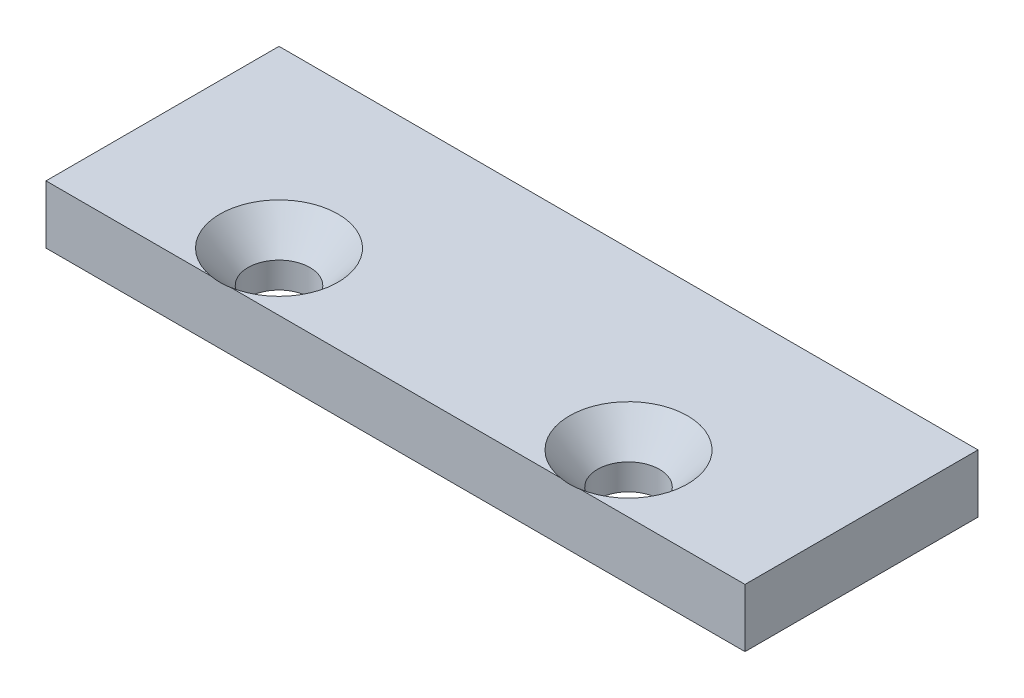
ISO-10303-21;
HEADER;
FILE_DESCRIPTION(('STEP AP214'),'2;1');
FILE_NAME('part.step','',(''),(''),'','','');
FILE_SCHEMA(('AUTOMOTIVE_DESIGN { 1 0 10303 214 1 1 1 1 }'));
ENDSEC;
DATA;
#1=APPLICATION_CONTEXT('core data for automotive mechanical design processes');
#2=APPLICATION_PROTOCOL_DEFINITION('international standard','automotive_design',2000,#1);
#3=PRODUCT_CONTEXT('',#1,'mechanical');
#4=PRODUCT('Part','Part','',(#3));
#5=PRODUCT_RELATED_PRODUCT_CATEGORY('part','',(#4));
#6=PRODUCT_DEFINITION_FORMATION('','',#4);
#7=PRODUCT_DEFINITION_CONTEXT('part definition',#1,'design');
#8=PRODUCT_DEFINITION('design','',#6,#7);
#9=PRODUCT_DEFINITION_SHAPE('','',#8);
#10=(LENGTH_UNIT() NAMED_UNIT(*) SI_UNIT(.MILLI.,.METRE.));
#11=(NAMED_UNIT(*) PLANE_ANGLE_UNIT() SI_UNIT($,.RADIAN.));
#12=(NAMED_UNIT(*) SI_UNIT($,.STERADIAN.) SOLID_ANGLE_UNIT());
#13=UNCERTAINTY_MEASURE_WITH_UNIT(LENGTH_MEASURE(1.E-05),#10,'distance_accuracy_value','');
#14=(GEOMETRIC_REPRESENTATION_CONTEXT(3) GLOBAL_UNCERTAINTY_ASSIGNED_CONTEXT((#13)) GLOBAL_UNIT_ASSIGNED_CONTEXT((#10,
#11,#12)) REPRESENTATION_CONTEXT('',''));
#15=CARTESIAN_POINT('',(0.,0.,0.));
#16=DIRECTION('',(0.,0.,1.));
#17=DIRECTION('',(1.,0.,0.));
#18=AXIS2_PLACEMENT_3D('',#15,#16,#17);
#19=CARTESIAN_POINT('',(0.,0.,0.));
#20=DIRECTION('',(0.,-1.,0.));
#21=DIRECTION('',(0.,0.,-1.));
#22=AXIS2_PLACEMENT_3D('',#19,#20,#21);
#23=PLANE('',#22);
#24=DIRECTION('',(1.,0.,0.));
#25=VECTOR('',#24,1.);
#26=CARTESIAN_POINT('',(0.,0.,0.));
#27=LINE('',#26,#25);
#28=CARTESIAN_POINT('',(0.,0.,0.));
#29=VERTEX_POINT('',#28);
#30=CARTESIAN_POINT('',(17.9837292979735,0.,0.));
#31=VERTEX_POINT('',#30);
#32=EDGE_CURVE('E96',#29,#31,#27,.T.);
#33=ORIENTED_EDGE('',*,*,#32,.T.);
#34=CARTESIAN_POINT('',(19.05,0.,-6.35));
#35=DIRECTION('',(0.,1.,0.));
#36=DIRECTION('',(0.,0.,1.));
#37=AXIS2_PLACEMENT_3D('',#34,#35,#36);
#38=CIRCLE('',#37,6.4389);
#39=CARTESIAN_POINT('',(20.1162707020265,0.,0.));
#40=VERTEX_POINT('',#39);
#41=EDGE_CURVE('E53',#40,#31,#38,.T.);
#42=ORIENTED_EDGE('',*,*,#41,.F.);
#43=CARTESIAN_POINT('',(56.0837292979735,0.,0.));
#44=VERTEX_POINT('',#43);
#45=EDGE_CURVE('E60',#40,#44,#27,.T.);
#46=ORIENTED_EDGE('',*,*,#45,.T.);
#47=CARTESIAN_POINT('',(57.15,0.,-6.35));
#48=DIRECTION('',(0.,1.,0.));
#49=DIRECTION('',(0.,0.,1.));
#50=AXIS2_PLACEMENT_3D('',#47,#48,#49);
#51=CIRCLE('',#50,6.4389);
#52=CARTESIAN_POINT('',(58.2162707020264,0.,0.));
#53=VERTEX_POINT('',#52);
#54=EDGE_CURVE('E174',#53,#44,#51,.T.);
#55=ORIENTED_EDGE('',*,*,#54,.F.);
#56=CARTESIAN_POINT('',(76.2,0.,0.));
#57=VERTEX_POINT('',#56);
#58=EDGE_CURVE('E102',#53,#57,#27,.T.);
#59=ORIENTED_EDGE('',*,*,#58,.T.);
#60=DIRECTION('',(0.,0.,-1.));
#61=VECTOR('',#60,1.);
#62=CARTESIAN_POINT('',(76.2,0.,0.));
#63=LINE('',#62,#61);
#64=CARTESIAN_POINT('',(76.2,0.,-25.4));
#65=VERTEX_POINT('',#64);
#66=EDGE_CURVE('E104',#57,#65,#63,.T.);
#67=ORIENTED_EDGE('',*,*,#66,.T.);
#68=DIRECTION('',(-1.,0.,0.));
#69=VECTOR('',#68,1.);
#70=CARTESIAN_POINT('',(0.,0.,-25.4));
#71=LINE('',#70,#69);
#72=CARTESIAN_POINT('',(0.,0.,-25.4));
#73=VERTEX_POINT('',#72);
#74=EDGE_CURVE('E111',#65,#73,#71,.T.);
#75=ORIENTED_EDGE('',*,*,#74,.T.);
#76=DIRECTION('',(0.,0.,1.));
#77=VECTOR('',#76,1.);
#78=CARTESIAN_POINT('',(0.,0.,0.));
#79=LINE('',#78,#77);
#80=EDGE_CURVE('E105',#73,#29,#79,.T.);
#81=ORIENTED_EDGE('',*,*,#80,.T.);
#82=EDGE_LOOP('',(#33,#42,#46,#55,#59,#67,#75,#81));
#83=FACE_BOUND('',#82,.T.);
#84=ADVANCED_FACE('F35',(#83),#23,.F.);
#85=CARTESIAN_POINT('',(0.,-6.35,0.));
#86=DIRECTION('',(-1.,0.,0.));
#87=DIRECTION('',(0.,0.,1.));
#88=AXIS2_PLACEMENT_3D('',#85,#86,#87);
#89=PLANE('',#88);
#90=ORIENTED_EDGE('',*,*,#80,.F.);
#91=DIRECTION('',(0.,1.,0.));
#92=VECTOR('',#91,1.);
#93=CARTESIAN_POINT('',(0.,-6.35,-25.4));
#94=LINE('',#93,#92);
#95=CARTESIAN_POINT('',(0.,-6.35,-25.4));
#96=VERTEX_POINT('',#95);
#97=EDGE_CURVE('E115',#96,#73,#94,.T.);
#98=ORIENTED_EDGE('',*,*,#97,.F.);
#99=DIRECTION('',(0.,0.,1.));
#100=VECTOR('',#99,1.);
#101=CARTESIAN_POINT('',(0.,-6.35,0.));
#102=LINE('',#101,#100);
#103=CARTESIAN_POINT('',(0.,-6.35,0.));
#104=VERTEX_POINT('',#103);
#105=EDGE_CURVE('E114',#96,#104,#102,.T.);
#106=ORIENTED_EDGE('',*,*,#105,.T.);
#107=DIRECTION('',(0.,1.,0.));
#108=VECTOR('',#107,1.);
#109=CARTESIAN_POINT('',(0.,-6.35,0.));
#110=LINE('',#109,#108);
#111=EDGE_CURVE('E122',#104,#29,#110,.T.);
#112=ORIENTED_EDGE('',*,*,#111,.T.);
#113=EDGE_LOOP('',(#90,#98,#106,#112));
#114=FACE_BOUND('',#113,.T.);
#115=ADVANCED_FACE('F37',(#114),#89,.T.);
#116=CARTESIAN_POINT('',(0.,-6.35,-25.4));
#117=DIRECTION('',(0.,0.,-1.));
#118=DIRECTION('',(-1.,0.,0.));
#119=AXIS2_PLACEMENT_3D('',#116,#117,#118);
#120=PLANE('',#119);
#121=ORIENTED_EDGE('',*,*,#74,.F.);
#122=DIRECTION('',(0.,1.,0.));
#123=VECTOR('',#122,1.);
#124=CARTESIAN_POINT('',(76.2,-6.35,-25.4));
#125=LINE('',#124,#123);
#126=CARTESIAN_POINT('',(76.2,-6.35,-25.4));
#127=VERTEX_POINT('',#126);
#128=EDGE_CURVE('E117',#127,#65,#125,.T.);
#129=ORIENTED_EDGE('',*,*,#128,.F.);
#130=DIRECTION('',(-1.,0.,0.));
#131=VECTOR('',#130,1.);
#132=CARTESIAN_POINT('',(0.,-6.35,-25.4));
#133=LINE('',#132,#131);
#134=EDGE_CURVE('E123',#127,#96,#133,.T.);
#135=ORIENTED_EDGE('',*,*,#134,.T.);
#136=ORIENTED_EDGE('',*,*,#97,.T.);
#137=EDGE_LOOP('',(#121,#129,#135,#136));
#138=FACE_BOUND('',#137,.T.);
#139=ADVANCED_FACE('F148',(#138),#120,.T.);
#140=CARTESIAN_POINT('',(76.2,-6.35,0.));
#141=DIRECTION('',(1.,0.,0.));
#142=DIRECTION('',(0.,0.,-1.));
#143=AXIS2_PLACEMENT_3D('',#140,#141,#142);
#144=PLANE('',#143);
#145=ORIENTED_EDGE('',*,*,#66,.F.);
#146=DIRECTION('',(0.,1.,0.));
#147=VECTOR('',#146,1.);
#148=CARTESIAN_POINT('',(76.2,-6.35,0.));
#149=LINE('',#148,#147);
#150=CARTESIAN_POINT('',(76.2,-6.35,0.));
#151=VERTEX_POINT('',#150);
#152=EDGE_CURVE('E119',#151,#57,#149,.T.);
#153=ORIENTED_EDGE('',*,*,#152,.F.);
#154=DIRECTION('',(0.,0.,-1.));
#155=VECTOR('',#154,1.);
#156=CARTESIAN_POINT('',(76.2,-6.35,0.));
#157=LINE('',#156,#155);
#158=EDGE_CURVE('E182',#151,#127,#157,.T.);
#159=ORIENTED_EDGE('',*,*,#158,.T.);
#160=ORIENTED_EDGE('',*,*,#128,.T.);
#161=EDGE_LOOP('',(#145,#153,#159,#160));
#162=FACE_BOUND('',#161,.T.);
#163=ADVANCED_FACE('F150',(#162),#144,.T.);
#164=CARTESIAN_POINT('',(0.,-6.35,0.));
#165=DIRECTION('',(0.,0.,1.));
#166=DIRECTION('',(1.,0.,0.));
#167=AXIS2_PLACEMENT_3D('',#164,#165,#166);
#168=PLANE('',#167);
#169=CARTESIAN_POINT('',(7.81328884384022,7.44049863140852,0.));
#170=CARTESIAN_POINT('',(8.03498579981093,7.21849015472124,0.));
#171=CARTESIAN_POINT('',(8.25745774593283,6.99724983586753,0.));
#172=CARTESIAN_POINT('',(8.7042730664479,6.55664003619176,0.));
#173=CARTESIAN_POINT('',(8.92861655672172,6.33727067294034,0.));
#174=CARTESIAN_POINT('',(9.37996343003784,5.90028623164501,0.));
#175=CARTESIAN_POINT('',(9.60697156909108,5.68267605865214,0.));
#176=CARTESIAN_POINT('',(10.0635597248201,5.25017717502742,0.));
#177=CARTESIAN_POINT('',(10.2931396858279,5.03528840570343,0.));
#178=CARTESIAN_POINT('',(10.7664165519392,4.5986456636929,0.));
#179=CARTESIAN_POINT('',(11.010263815495,4.37705430759513,0.));
#180=CARTESIAN_POINT('',(11.5020486524363,3.938461046281,0.));
#181=CARTESIAN_POINT('',(11.749986096275,3.72145899620406,0.));
#182=CARTESIAN_POINT('',(12.2506636976284,3.29350848456074,0.));
#183=CARTESIAN_POINT('',(12.5033993358133,3.08255475478925,0.));
#184=CARTESIAN_POINT('',(13.0150521605854,2.66831015776152,0.));
#185=CARTESIAN_POINT('',(13.2739685301341,2.46501828673705,0.));
#186=CARTESIAN_POINT('',(13.7968663901659,2.07065067077217,0.));
#187=CARTESIAN_POINT('',(14.0607694282366,1.87947158848659,0.));
#188=CARTESIAN_POINT('',(14.5982049907559,1.5106157262426,0.));
#189=CARTESIAN_POINT('',(14.8717435474858,1.33294763278644,0.));
#190=CARTESIAN_POINT('',(15.427072213024,0.998671846128632,0.));
#191=CARTESIAN_POINT('',(15.7087243333204,0.841837488465093,0.));
#192=CARTESIAN_POINT('',(16.2850565414673,0.554590736462985,0.));
#193=CARTESIAN_POINT('',(16.5797145081131,0.424135435999751,0.));
#194=CARTESIAN_POINT('',(17.0158687236816,0.261975026358653,0.));
#195=CARTESIAN_POINT('',(17.1519279286928,0.215562431055941,0.));
#196=CARTESIAN_POINT('',(17.4269481988111,0.131027700368054,0.));
#197=CARTESIAN_POINT('',(17.5659149641831,0.0929239353833622,0.));
#198=CARTESIAN_POINT('',(17.8681335927669,0.0209405146878551,0.));
#199=CARTESIAN_POINT('',(18.0317732503603,-0.0113370924451459,0.));
#200=CARTESIAN_POINT('',(18.3612663218838,-0.0618266854252568,0.));
#201=CARTESIAN_POINT('',(18.5271201546465,-0.0800359706363795,0.));
#202=CARTESIAN_POINT('',(18.8596264521958,-0.101477227274947,0.));
#203=CARTESIAN_POINT('',(19.0262778536147,-0.104725448338475,0.));
#204=CARTESIAN_POINT('',(19.3591766639838,-0.096120089611934,0.));
#205=CARTESIAN_POINT('',(19.5254240946285,-0.0842673395901676,0.));
#206=CARTESIAN_POINT('',(19.8501451552072,-0.0467641863848536,0.));
#207=CARTESIAN_POINT('',(20.0086801623055,-0.0216361357292754,0.));
#208=CARTESIAN_POINT('',(20.3232910406231,0.0410063196391245,0.));
#209=CARTESIAN_POINT('',(20.4793663824849,0.078523353516478,0.));
#210=CARTESIAN_POINT('',(20.7886607093521,0.164631083129781,0.));
#211=CARTESIAN_POINT('',(20.9418749035417,0.213238815147813,0.));
#212=CARTESIAN_POINT('',(21.2448998699712,0.320019125693918,0.));
#213=CARTESIAN_POINT('',(21.3947106341409,0.378191726899148,0.));
#214=CARTESIAN_POINT('',(21.7374026615151,0.522244538230225,0.));
#215=CARTESIAN_POINT('',(21.9290341610014,0.611088805261015,0.));
#216=CARTESIAN_POINT('',(22.3066812861559,0.80007153651547,0.));
#217=CARTESIAN_POINT('',(22.4926943406766,0.900215075208541,0.));
#218=CARTESIAN_POINT('',(22.8598847501826,1.10968022612962,0.));
#219=CARTESIAN_POINT('',(23.0410528831167,1.21901789836693,0.));
#220=CARTESIAN_POINT('',(23.39877520913,1.44490121428944,0.));
#221=CARTESIAN_POINT('',(23.5753300410817,1.56144585231193,0.));
#222=CARTESIAN_POINT('',(23.9270948617037,1.80218428187445,0.));
#223=CARTESIAN_POINT('',(24.1022433228097,1.92646759393934,0.));
#224=CARTESIAN_POINT('',(24.4489662757597,2.1799159847183,0.));
#225=CARTESIAN_POINT('',(24.6205406640266,2.30908120460626,0.));
#226=CARTESIAN_POINT('',(24.9604082803331,2.57127332720532,0.));
#227=CARTESIAN_POINT('',(25.1287048583733,2.70429589943155,0.));
#228=CARTESIAN_POINT('',(25.4626120100046,2.97364896321472,0.));
#229=CARTESIAN_POINT('',(25.6282226922416,3.10997932041029,0.));
#230=CARTESIAN_POINT('',(25.9848459239903,3.40863273587356,0.));
#231=CARTESIAN_POINT('',(26.1754334312715,3.57146274091856,0.));
#232=CARTESIAN_POINT('',(26.5539021784172,3.90024183582152,0.));
#233=CARTESIAN_POINT('',(26.7417833317022,4.06619102507619,0.));
#234=CARTESIAN_POINT('',(27.3020112320049,4.56794678191887,0.));
#235=CARTESIAN_POINT('',(27.6708943790374,4.90762084472473,0.));
#236=CARTESIAN_POINT('',(28.4019420190973,5.59444785670767,0.));
#237=CARTESIAN_POINT('',(28.7641029879997,5.94160453344121,0.));
#238=CARTESIAN_POINT('',(29.4831477408001,6.64135169863086,0.));
#239=CARTESIAN_POINT('',(29.8400313679432,6.99394234786158,0.));
#240=CARTESIAN_POINT('',(30.5505423009384,7.70411102441935,0.));
#241=CARTESIAN_POINT('',(30.9041594866532,8.06169915436874,0.));
#242=CARTESIAN_POINT('',(31.6081079513749,8.78010159742942,0.));
#243=CARTESIAN_POINT('',(31.9584391807441,9.14091595911572,0.));
#244=CARTESIAN_POINT('',(32.6563360221218,9.86498300824265,0.));
#245=CARTESIAN_POINT('',(33.0039024873566,10.2282348741607,0.));
#246=CARTESIAN_POINT('',(33.6968651993117,10.9568025583907,0.));
#247=CARTESIAN_POINT('',(34.0422614409727,11.3221183815104,0.));
#248=CARTESIAN_POINT('',(34.9914115082091,12.3309278995533,0.));
#249=CARTESIAN_POINT('',(35.5933060387129,12.9761706016886,0.));
#250=CARTESIAN_POINT('',(36.7931065384784,14.2704584029865,0.));
#251=CARTESIAN_POINT('',(37.3910121312153,14.9195038505352,0.));
#252=CARTESIAN_POINT('',(38.5810887914953,16.2175031467259,0.));
#253=CARTESIAN_POINT('',(39.1732735444313,16.8664444544419,0.));
#254=CARTESIAN_POINT('',(40.0597439908888,17.8414324505413,0.));
#255=CARTESIAN_POINT('',(40.3549169510972,18.1666733120142,0.));
#256=CARTESIAN_POINT('',(40.9447339938485,18.8176335386357,0.));
#257=CARTESIAN_POINT('',(41.2393780770415,19.1433529031953,0.));
#258=CARTESIAN_POINT('',(41.5337893152604,19.4692826405497,0.));
#259=B_SPLINE_CURVE_WITH_KNOTS('',3,(#169,#170,#171,#172,#173,#174,#175,#176,#177,#178,#179,
#180,#181,#182,#183,#184,#185,#186,#187,#188,#189,#190,#191,#192,#193,#194,#195,#196,#197,#198,
#199,#200,#201,#202,#203,#204,#205,#206,#207,#208,#209,#210,#211,#212,#213,#214,#215,#216,#217,
#218,#219,#220,#221,#222,#223,#224,#225,#226,#227,#228,#229,#230,#231,#232,#233,#234,#235,#236,
#237,#238,#239,#240,#241,#242,#243,#244,#245,#246,#247,#248,#249,#250,#251,#252,#253,#254,#255,
#256,#257,#258),.UNSPECIFIED.,.F.,.F.,(4,2,2,2,2,2,2,2,2,2,2,2,2,2,2,2,2,2,2,2,2,2,2,2,2,2,2,2,
2,2,2,2,2,2,2,2,2,2,2,2,2,2,2,2,4),(0.,0.941245743909448,1.88255020612765,2.82591995444439,
3.7692693224659,4.75769608650737,5.74609160433784,6.7335983084664,7.72097518795948,
8.69829509277761,9.67623811639934,10.6424735377118,11.6071244848563,12.0381759721103,
12.4701710405862,12.9699798269576,13.4698845356748,13.969246155474,14.4685803375295,
14.9495884680659,15.4306987428295,15.9125530806296,16.394408560865,17.02759649042,
17.6610699232206,18.2956738351947,18.930189393252,19.5743774162469,20.2185840819974,
20.8620935718945,21.5055769662194,22.2575549249505,23.009556887166,24.5137496156448,
26.0187098353785,27.5237146680833,29.0324067494068,30.5411215843826,32.0493511945317,
33.5575843194882,36.204732718593,38.8521275495518,41.4876969373442,42.8053376841851,
44.1229768103404),.UNSPECIFIED.);
#260=EDGE_CURVE('E11',#31,#40,#259,.T.);
#261=ORIENTED_EDGE('',*,*,#260,.F.);
#262=ORIENTED_EDGE('',*,*,#32,.F.);
#263=ORIENTED_EDGE('',*,*,#111,.F.);
#264=DIRECTION('',(1.,0.,0.));
#265=VECTOR('',#264,1.);
#266=CARTESIAN_POINT('',(0.,-6.35,0.));
#267=LINE('',#266,#265);
#268=EDGE_CURVE('E179',#104,#151,#267,.T.);
#269=ORIENTED_EDGE('',*,*,#268,.T.);
#270=ORIENTED_EDGE('',*,*,#152,.T.);
#271=ORIENTED_EDGE('',*,*,#58,.F.);
#272=CARTESIAN_POINT('',(45.913288840901,7.44049863435221,0.));
#273=CARTESIAN_POINT('',(46.1349857969533,7.21849015756911,0.));
#274=CARTESIAN_POINT('',(46.357457743157,6.99724983861964,0.));
#275=CARTESIAN_POINT('',(46.8042730638359,6.55664003875254,0.));
#276=CARTESIAN_POINT('',(47.0286165541918,6.33727067540555,0.));
#277=CARTESIAN_POINT('',(47.4799634276728,5.90028623391907,0.));
#278=CARTESIAN_POINT('',(47.7069715668088,5.68267606083062,0.));
#279=CARTESIAN_POINT('',(48.1635597227041,5.2501771770152,0.));
#280=CARTESIAN_POINT('',(48.3931396837953,5.03528840759608,0.));
#281=CARTESIAN_POINT('',(48.8664165500826,4.59864566538754,0.));
#282=CARTESIAN_POINT('',(49.1102638137312,4.37705430918698,0.));
#283=CARTESIAN_POINT('',(49.6020486508594,3.93846104766862,0.));
#284=CARTESIAN_POINT('',(49.8499860947923,3.72145899749025,0.));
#285=CARTESIAN_POINT('',(50.3506636963363,3.2935084856463,0.));
#286=CARTESIAN_POINT('',(50.6033993346176,3.08255475577563,0.));
#287=CARTESIAN_POINT('',(51.1150521595855,2.66831015855283,0.));
#288=CARTESIAN_POINT('',(51.3739685292337,2.46501828743248,0.));
#289=CARTESIAN_POINT('',(51.8968663894107,2.07065067132556,0.));
#290=CARTESIAN_POINT('',(52.1607694275253,1.87947158899156,0.));
#291=CARTESIAN_POINT('',(52.6982049901345,1.51061572665232,0.));
#292=CARTESIAN_POINT('',(52.9717435469104,1.33294763314933,0.));
#293=CARTESIAN_POINT('',(53.5270722125426,0.998671846402116,0.));
#294=CARTESIAN_POINT('',(53.8087243328868,0.84183748869592,0.));
#295=CARTESIAN_POINT('',(54.3850565411337,0.554590736614651,0.));
#296=CARTESIAN_POINT('',(54.6797145078316,0.42413543611489,0.));
#297=CARTESIAN_POINT('',(55.1158687234701,0.261975026432642,0.));
#298=CARTESIAN_POINT('',(55.2519279284966,0.21556243112028,0.));
#299=CARTESIAN_POINT('',(55.5269481986464,0.131027700414653,0.));
#300=CARTESIAN_POINT('',(55.6659149640346,0.0929239354218783,0.));
#301=CARTESIAN_POINT('',(55.9681335926711,0.0209405147070631,0.));
#302=CARTESIAN_POINT('',(56.1317732503014,-0.0113370924354945,0.));
#303=CARTESIAN_POINT('',(56.4612663218998,-0.0618266854283339,0.));
#304=CARTESIAN_POINT('',(56.6271201547006,-0.0800359706426265,0.));
#305=CARTESIAN_POINT('',(56.9596264523261,-0.101477227280582,0.));
#306=CARTESIAN_POINT('',(57.1262778537832,-0.104725448340333,0.));
#307=CARTESIAN_POINT('',(57.4591766642279,-0.0961200895994018,0.));
#308=CARTESIAN_POINT('',(57.6254240949101,-0.0842673395670238,0.));
#309=CARTESIAN_POINT('',(57.9501451554976,-0.0467641863422638,0.));
#310=CARTESIAN_POINT('',(58.108680162568,-0.0216361356833942,0.));
#311=CARTESIAN_POINT('',(58.4232910408303,0.0410063196867776,0.));
#312=CARTESIAN_POINT('',(58.5793663826646,0.0785233535626076,0.));
#313=CARTESIAN_POINT('',(58.8886607094774,0.164631083168582,0.));
#314=CARTESIAN_POINT('',(59.0418749036401,0.213238815180776,0.));
#315=CARTESIAN_POINT('',(59.3448998700169,0.32001912571172,0.));
#316=CARTESIAN_POINT('',(59.4947106341608,0.378191726907627,0.));
#317=CARTESIAN_POINT('',(59.8374026615101,0.522244538228004,0.));
#318=CARTESIAN_POINT('',(60.0290341609969,0.611088805258838,0.));
#319=CARTESIAN_POINT('',(60.406681286152,0.800071536513437,0.));
#320=CARTESIAN_POINT('',(60.5926943406731,0.90021507520661,0.));
#321=CARTESIAN_POINT('',(60.9598847501798,1.10968022612795,0.));
#322=CARTESIAN_POINT('',(61.1410528831142,1.21901789836541,0.));
#323=CARTESIAN_POINT('',(61.4987752091281,1.44490121428827,0.));
#324=CARTESIAN_POINT('',(61.6753300410802,1.56144585231094,0.));
#325=CARTESIAN_POINT('',(62.027094861703,1.80218428187399,0.));
#326=CARTESIAN_POINT('',(62.2022433228096,1.92646759393924,0.));
#327=CARTESIAN_POINT('',(62.5489662757606,2.17991598471893,0.));
#328=CARTESIAN_POINT('',(62.720540664028,2.30908120460726,0.));
#329=CARTESIAN_POINT('',(63.0604082803354,2.5712733272071,0.));
#330=CARTESIAN_POINT('',(63.228704858376,2.70429589943372,0.));
#331=CARTESIAN_POINT('',(63.5626120100082,2.97364896321769,0.));
#332=CARTESIAN_POINT('',(63.7282226922457,3.10997932041367,0.));
#333=CARTESIAN_POINT('',(64.0848459239948,3.40863273587738,0.));
#334=CARTESIAN_POINT('',(64.2754334312759,3.57146274092239,0.));
#335=CARTESIAN_POINT('',(64.6539021784215,3.90024183582538,0.));
#336=CARTESIAN_POINT('',(64.8417833317065,4.06619102508006,0.));
#337=CARTESIAN_POINT('',(65.4020112320092,4.56794678192278,0.));
#338=CARTESIAN_POINT('',(65.7708943790417,4.90762084472865,0.));
#339=CARTESIAN_POINT('',(66.5019420191014,5.59444785671162,0.));
#340=CARTESIAN_POINT('',(66.8641029880038,5.94160453344516,0.));
#341=CARTESIAN_POINT('',(67.5831477408041,6.64135169863483,0.));
#342=CARTESIAN_POINT('',(67.9400313679472,6.99394234786554,0.));
#343=CARTESIAN_POINT('',(68.6505423009423,7.7041110244233,0.));
#344=CARTESIAN_POINT('',(69.0041594866571,8.06169915437269,0.));
#345=CARTESIAN_POINT('',(69.7081079513787,8.78010159743336,0.));
#346=CARTESIAN_POINT('',(70.0584391807479,9.14091595911966,0.));
#347=CARTESIAN_POINT('',(70.7563360221256,9.86498300824657,0.));
#348=CARTESIAN_POINT('',(71.1039024873603,10.2282348741647,0.));
#349=CARTESIAN_POINT('',(71.7968651993154,10.9568025583946,0.));
#350=CARTESIAN_POINT('',(72.1422614409764,11.3221183815143,0.));
#351=CARTESIAN_POINT('',(73.0914115082121,12.3309278995566,0.));
#352=CARTESIAN_POINT('',(73.6933060387153,12.9761706016912,0.));
#353=CARTESIAN_POINT('',(74.8931065384795,14.2704584029878,0.));
#354=CARTESIAN_POINT('',(75.4910121312159,14.9195038505358,0.));
#355=CARTESIAN_POINT('',(76.6810887914947,16.2175031467252,0.));
#356=CARTESIAN_POINT('',(77.2732735444301,16.8664444544405,0.));
#357=CARTESIAN_POINT('',(78.1597439908867,17.841432450539,0.));
#358=CARTESIAN_POINT('',(78.4549169510948,18.1666733120116,0.));
#359=CARTESIAN_POINT('',(79.0447339938455,18.8176335386324,0.));
#360=CARTESIAN_POINT('',(79.3393780770381,19.1433529031916,0.));
#361=CARTESIAN_POINT('',(79.6337893152567,19.4692826405457,0.));
#362=B_SPLINE_CURVE_WITH_KNOTS('',3,(#272,#273,#274,#275,#276,#277,#278,#279,#280,#281,#282,
#283,#284,#285,#286,#287,#288,#289,#290,#291,#292,#293,#294,#295,#296,#297,#298,#299,#300,#301,
#302,#303,#304,#305,#306,#307,#308,#309,#310,#311,#312,#313,#314,#315,#316,#317,#318,#319,#320,
#321,#322,#323,#324,#325,#326,#327,#328,#329,#330,#331,#332,#333,#334,#335,#336,#337,#338,#339,
#340,#341,#342,#343,#344,#345,#346,#347,#348,#349,#350,#351,#352,#353,#354,#355,#356,#357,#358,
#359,#360,#361),.UNSPECIFIED.,.F.,.F.,(4,2,2,2,2,2,2,2,2,2,2,2,2,2,2,2,2,2,2,2,2,2,2,2,2,2,2,2,
2,2,2,2,2,2,2,2,2,2,2,2,2,2,2,2,4),(0.,0.941245744285919,1.88255020688061,2.82591995557511,
3.76926932397438,4.75769608842901,5.74609160667264,6.7335983112137,7.72097519111915,
8.69829509612913,9.67623811994308,10.6424735414429,11.6071244887742,12.0381759760809,
12.47017104461,12.9699798310953,13.4698845399264,13.9692461598395,14.4685803420089,
14.9495884724645,15.4306987471472,15.9125530848652,16.3944085650186,17.0275964945746,
17.6610699273763,18.2956738393515,18.9301893974099,19.5743774204067,20.218584086159,
20.8620935760579,21.5055769703846,22.2575549291156,23.0095568913311,24.5137496198098,
26.0187098395434,27.5237146722481,29.0324067535716,30.5411215885473,32.0493511986964,
33.5575843236528,36.2047327227549,38.852127553711,41.4876969415007,42.8053376883403,
44.1229768144942),.UNSPECIFIED.);
#363=EDGE_CURVE('E48',#44,#53,#362,.T.);
#364=ORIENTED_EDGE('',*,*,#363,.F.);
#365=ORIENTED_EDGE('',*,*,#45,.F.);
#366=EDGE_LOOP('',(#261,#262,#263,#269,#270,#271,#364,#365));
#367=FACE_BOUND('',#366,.T.);
#368=ADVANCED_FACE('F100',(#367),#168,.T.);
#369=CARTESIAN_POINT('',(0.,-6.35,0.));
#370=DIRECTION('',(0.,-1.,0.));
#371=DIRECTION('',(0.,0.,-1.));
#372=AXIS2_PLACEMENT_3D('',#369,#370,#371);
#373=PLANE('',#372);
#374=CARTESIAN_POINT('',(19.05,-6.35,-6.35));
#375=DIRECTION('',(0.,1.,0.));
#376=DIRECTION('',(0.,0.,1.));
#377=AXIS2_PLACEMENT_3D('',#374,#375,#376);
#378=CIRCLE('',#377,3.3782);
#379=CARTESIAN_POINT('',(19.05,-6.35,-2.9718));
#380=VERTEX_POINT('',#379);
#381=EDGE_CURVE('E186',#380,#380,#378,.T.);
#382=ORIENTED_EDGE('',*,*,#381,.T.);
#383=EDGE_LOOP('',(#382));
#384=FACE_BOUND('',#383,.T.);
#385=CARTESIAN_POINT('',(57.15,-6.35,-6.35));
#386=DIRECTION('',(0.,1.,0.));
#387=DIRECTION('',(0.,0.,1.));
#388=AXIS2_PLACEMENT_3D('',#385,#386,#387);
#389=CIRCLE('',#388,3.3782);
#390=CARTESIAN_POINT('',(57.15,-6.35,-2.9718));
#391=VERTEX_POINT('',#390);
#392=EDGE_CURVE('E167',#391,#391,#389,.T.);
#393=ORIENTED_EDGE('',*,*,#392,.T.);
#394=EDGE_LOOP('',(#393));
#395=FACE_BOUND('',#394,.T.);
#396=ORIENTED_EDGE('',*,*,#105,.F.);
#397=ORIENTED_EDGE('',*,*,#134,.F.);
#398=ORIENTED_EDGE('',*,*,#158,.F.);
#399=ORIENTED_EDGE('',*,*,#268,.F.);
#400=EDGE_LOOP('',(#396,#397,#398,#399));
#401=FACE_BOUND('',#400,.T.);
#402=ADVANCED_FACE('F141',(#384,#395,#401),#373,.T.);
#403=CARTESIAN_POINT('',(57.15,0.,-6.35));
#404=DIRECTION('',(0.,1.,0.));
#405=DIRECTION('',(0.,0.,1.));
#406=AXIS2_PLACEMENT_3D('',#403,#404,#405);
#407=CYLINDRICAL_SURFACE('',#406,3.3782);
#408=ORIENTED_EDGE('',*,*,#392,.F.);
#409=EDGE_LOOP('',(#408));
#410=FACE_BOUND('',#409,.T.);
#411=CARTESIAN_POINT('',(57.15,-3.52093258398134,-6.35));
#412=DIRECTION('',(0.,1.,0.));
#413=DIRECTION('',(0.,0.,1.));
#414=AXIS2_PLACEMENT_3D('',#411,#412,#413);
#415=CIRCLE('',#414,3.3782);
#416=CARTESIAN_POINT('',(57.15,-3.52093258398134,-2.9718));
#417=VERTEX_POINT('',#416);
#418=EDGE_CURVE('E169',#417,#417,#415,.T.);
#419=ORIENTED_EDGE('',*,*,#418,.T.);
#420=EDGE_LOOP('',(#419));
#421=FACE_BOUND('',#420,.T.);
#422=ADVANCED_FACE('F137',(#410,#421),#407,.F.);
#423=CARTESIAN_POINT('',(57.15,0.,-6.35));
#424=DIRECTION('',(0.,1.,0.));
#425=DIRECTION('',(0.,0.,1.));
#426=AXIS2_PLACEMENT_3D('',#423,#424,#425);
#427=CONICAL_SURFACE('',#426,6.4389,0.715584993317675);
#428=ORIENTED_EDGE('',*,*,#363,.T.);
#429=ORIENTED_EDGE('',*,*,#54,.T.);
#430=EDGE_LOOP('',(#428,#429));
#431=FACE_BOUND('',#430,.T.);
#432=ORIENTED_EDGE('',*,*,#418,.F.);
#433=EDGE_LOOP('',(#432));
#434=FACE_BOUND('',#433,.T.);
#435=ADVANCED_FACE('F131',(#431,#434),#427,.F.);
#436=CARTESIAN_POINT('',(19.05,0.,-6.35));
#437=DIRECTION('',(0.,1.,0.));
#438=DIRECTION('',(0.,0.,1.));
#439=AXIS2_PLACEMENT_3D('',#436,#437,#438);
#440=CYLINDRICAL_SURFACE('',#439,3.3782);
#441=ORIENTED_EDGE('',*,*,#381,.F.);
#442=EDGE_LOOP('',(#441));
#443=FACE_BOUND('',#442,.T.);
#444=CARTESIAN_POINT('',(19.05,-3.52093258398134,-6.35));
#445=DIRECTION('',(0.,1.,0.));
#446=DIRECTION('',(0.,0.,1.));
#447=AXIS2_PLACEMENT_3D('',#444,#445,#446);
#448=CIRCLE('',#447,3.3782);
#449=CARTESIAN_POINT('',(19.05,-3.52093258398134,-2.9718));
#450=VERTEX_POINT('',#449);
#451=EDGE_CURVE('E97',#450,#450,#448,.T.);
#452=ORIENTED_EDGE('',*,*,#451,.T.);
#453=EDGE_LOOP('',(#452));
#454=FACE_BOUND('',#453,.T.);
#455=ADVANCED_FACE('F136',(#443,#454),#440,.F.);
#456=CARTESIAN_POINT('',(19.05,0.,-6.35));
#457=DIRECTION('',(0.,1.,0.));
#458=DIRECTION('',(0.,0.,1.));
#459=AXIS2_PLACEMENT_3D('',#456,#457,#458);
#460=CONICAL_SURFACE('',#459,6.4389,0.715584993317676);
#461=ORIENTED_EDGE('',*,*,#260,.T.);
#462=ORIENTED_EDGE('',*,*,#41,.T.);
#463=EDGE_LOOP('',(#461,#462));
#464=FACE_BOUND('',#463,.T.);
#465=ORIENTED_EDGE('',*,*,#451,.F.);
#466=EDGE_LOOP('',(#465));
#467=FACE_BOUND('',#466,.T.);
#468=ADVANCED_FACE('F90',(#464,#467),#460,.F.);
#469=CLOSED_SHELL('',(#84,#115,#139,#163,#368,#402,#422,#435,#455,#468));
#470=MANIFOLD_SOLID_BREP('B2',#469);
#471=ADVANCED_BREP_SHAPE_REPRESENTATION('',(#18,#470),#14);
#472=SHAPE_DEFINITION_REPRESENTATION(#9,#471);
ENDSEC;
END-ISO-10303-21;
